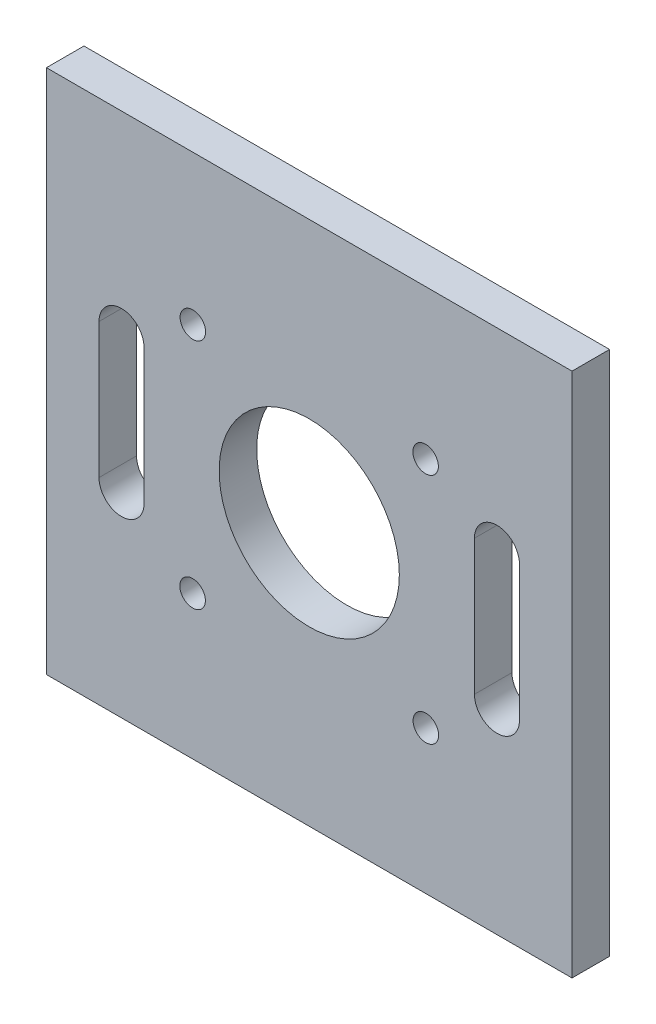
ISO-10303-21;
HEADER;
FILE_DESCRIPTION(('STEP AP214'),'2;1');
FILE_NAME('part.step','',(''),(''),'','','');
FILE_SCHEMA(('AUTOMOTIVE_DESIGN { 1 0 10303 214 1 1 1 1 }'));
ENDSEC;
DATA;
#1=APPLICATION_CONTEXT('core data for automotive mechanical design processes');
#2=APPLICATION_PROTOCOL_DEFINITION('international standard','automotive_design',2000,#1);
#3=PRODUCT_CONTEXT('',#1,'mechanical');
#4=PRODUCT('Part','Part','',(#3));
#5=PRODUCT_RELATED_PRODUCT_CATEGORY('part','',(#4));
#6=PRODUCT_DEFINITION_FORMATION('','',#4);
#7=PRODUCT_DEFINITION_CONTEXT('part definition',#1,'design');
#8=PRODUCT_DEFINITION('design','',#6,#7);
#9=PRODUCT_DEFINITION_SHAPE('','',#8);
#10=(LENGTH_UNIT() NAMED_UNIT(*) SI_UNIT(.MILLI.,.METRE.));
#11=(NAMED_UNIT(*) PLANE_ANGLE_UNIT() SI_UNIT($,.RADIAN.));
#12=(NAMED_UNIT(*) SI_UNIT($,.STERADIAN.) SOLID_ANGLE_UNIT());
#13=UNCERTAINTY_MEASURE_WITH_UNIT(LENGTH_MEASURE(1.E-05),#10,'distance_accuracy_value','');
#14=(GEOMETRIC_REPRESENTATION_CONTEXT(3) GLOBAL_UNCERTAINTY_ASSIGNED_CONTEXT((#13)) GLOBAL_UNIT_ASSIGNED_CONTEXT((#10,
#11,#12)) REPRESENTATION_CONTEXT('',''));
#15=CARTESIAN_POINT('',(0.,0.,0.));
#16=DIRECTION('',(0.,0.,1.));
#17=DIRECTION('',(1.,0.,0.));
#18=AXIS2_PLACEMENT_3D('',#15,#16,#17);
#19=CARTESIAN_POINT('',(0.,0.,5.));
#20=DIRECTION('',(0.,0.,-1.));
#21=DIRECTION('',(-1.,0.,0.));
#22=AXIS2_PLACEMENT_3D('',#19,#20,#21);
#23=PLANE('',#22);
#24=DIRECTION('',(0.,-1.,0.));
#25=VECTOR('',#24,1.);
#26=CARTESIAN_POINT('',(-27.9999999999999,9.2232248104714,5.));
#27=LINE('',#26,#25);
#28=CARTESIAN_POINT('',(-27.9999999999999,9.2232248104714,5.));
#29=VERTEX_POINT('',#28);
#30=CARTESIAN_POINT('',(-27.9999999999999,-8.77677518952859,5.));
#31=VERTEX_POINT('',#30);
#32=EDGE_CURVE('E175',#29,#31,#27,.T.);
#33=ORIENTED_EDGE('',*,*,#32,.F.);
#34=CARTESIAN_POINT('',(-24.9999999999999,9.2232248104714,5.));
#35=DIRECTION('',(0.,0.,1.));
#36=DIRECTION('',(1.,0.,0.));
#37=AXIS2_PLACEMENT_3D('',#34,#35,#36);
#38=CIRCLE('',#37,3.);
#39=CARTESIAN_POINT('',(-21.9999999999999,9.2232248104714,5.));
#40=VERTEX_POINT('',#39);
#41=EDGE_CURVE('E61',#40,#29,#38,.T.);
#42=ORIENTED_EDGE('',*,*,#41,.F.);
#43=DIRECTION('',(0.,-1.,0.));
#44=VECTOR('',#43,1.);
#45=CARTESIAN_POINT('',(-21.9999999999999,9.2232248104714,5.));
#46=LINE('',#45,#44);
#47=CARTESIAN_POINT('',(-21.9999999999999,-8.77677518952859,5.));
#48=VERTEX_POINT('',#47);
#49=EDGE_CURVE('E157',#40,#48,#46,.T.);
#50=ORIENTED_EDGE('',*,*,#49,.T.);
#51=CARTESIAN_POINT('',(-24.9999999999999,-8.77677518952859,5.));
#52=DIRECTION('',(0.,0.,1.));
#53=DIRECTION('',(1.,0.,0.));
#54=AXIS2_PLACEMENT_3D('',#51,#52,#53);
#55=CIRCLE('',#54,3.);
#56=EDGE_CURVE('E162',#31,#48,#55,.T.);
#57=ORIENTED_EDGE('',*,*,#56,.F.);
#58=EDGE_LOOP('',(#33,#42,#50,#57));
#59=FACE_BOUND('',#58,.T.);
#60=CARTESIAN_POINT('',(-15.5,15.112797807295,5.));
#61=DIRECTION('',(0.,0.,-1.));
#62=DIRECTION('',(-1.,0.,0.));
#63=AXIS2_PLACEMENT_3D('',#60,#61,#62);
#64=CIRCLE('',#63,1.7);
#65=CARTESIAN_POINT('',(-17.2,15.112797807295,5.));
#66=VERTEX_POINT('',#65);
#67=EDGE_CURVE('E252',#66,#66,#64,.T.);
#68=ORIENTED_EDGE('',*,*,#67,.T.);
#69=EDGE_LOOP('',(#68));
#70=FACE_BOUND('',#69,.T.);
#71=CARTESIAN_POINT('',(-15.5322926347606,-15.8871853731156,5.));
#72=DIRECTION('',(0.,0.,-1.));
#73=DIRECTION('',(-1.,0.,0.));
#74=AXIS2_PLACEMENT_3D('',#71,#72,#73);
#75=CIRCLE('',#74,1.7);
#76=CARTESIAN_POINT('',(-17.2322926347606,-15.8871853731156,5.));
#77=VERTEX_POINT('',#76);
#78=EDGE_CURVE('E243',#77,#77,#75,.T.);
#79=ORIENTED_EDGE('',*,*,#78,.T.);
#80=EDGE_LOOP('',(#79));
#81=FACE_BOUND('',#80,.T.);
#82=DIRECTION('',(0.,-1.,0.));
#83=VECTOR('',#82,1.);
#84=CARTESIAN_POINT('',(-35.,35.,5.));
#85=LINE('',#84,#83);
#86=CARTESIAN_POINT('',(-35.,35.,5.));
#87=VERTEX_POINT('',#86);
#88=CARTESIAN_POINT('',(-35.,-35.,5.));
#89=VERTEX_POINT('',#88);
#90=EDGE_CURVE('E270',#87,#89,#85,.T.);
#91=ORIENTED_EDGE('',*,*,#90,.T.);
#92=DIRECTION('',(1.,0.,0.));
#93=VECTOR('',#92,1.);
#94=CARTESIAN_POINT('',(35.,-35.,5.));
#95=LINE('',#94,#93);
#96=CARTESIAN_POINT('',(35.,-35.,5.));
#97=VERTEX_POINT('',#96);
#98=EDGE_CURVE('E271',#89,#97,#95,.T.);
#99=ORIENTED_EDGE('',*,*,#98,.T.);
#100=DIRECTION('',(0.,1.,0.));
#101=VECTOR('',#100,1.);
#102=CARTESIAN_POINT('',(35.,35.,5.));
#103=LINE('',#102,#101);
#104=CARTESIAN_POINT('',(35.,35.,5.));
#105=VERTEX_POINT('',#104);
#106=EDGE_CURVE('E274',#97,#105,#103,.T.);
#107=ORIENTED_EDGE('',*,*,#106,.T.);
#108=DIRECTION('',(-1.,0.,0.));
#109=VECTOR('',#108,1.);
#110=CARTESIAN_POINT('',(35.,35.,5.));
#111=LINE('',#110,#109);
#112=EDGE_CURVE('E279',#105,#87,#111,.T.);
#113=ORIENTED_EDGE('',*,*,#112,.T.);
#114=EDGE_LOOP('',(#91,#99,#107,#113));
#115=FACE_BOUND('',#114,.T.);
#116=CARTESIAN_POINT('',(15.5,15.112797807295,5.));
#117=DIRECTION('',(0.,0.,1.));
#118=DIRECTION('',(1.,0.,0.));
#119=AXIS2_PLACEMENT_3D('',#116,#117,#118);
#120=CIRCLE('',#119,1.7);
#121=CARTESIAN_POINT('',(17.2,15.112797807295,5.));
#122=VERTEX_POINT('',#121);
#123=EDGE_CURVE('E232',#122,#122,#120,.T.);
#124=ORIENTED_EDGE('',*,*,#123,.F.);
#125=EDGE_LOOP('',(#124));
#126=FACE_BOUND('',#125,.T.);
#127=CARTESIAN_POINT('',(15.5322926347607,-15.8871853731156,5.));
#128=DIRECTION('',(0.,0.,1.));
#129=DIRECTION('',(1.,0.,0.));
#130=AXIS2_PLACEMENT_3D('',#127,#128,#129);
#131=CIRCLE('',#130,1.7);
#132=CARTESIAN_POINT('',(17.2322926347607,-15.8871853731156,5.));
#133=VERTEX_POINT('',#132);
#134=EDGE_CURVE('E230',#133,#133,#131,.T.);
#135=ORIENTED_EDGE('',*,*,#134,.F.);
#136=EDGE_LOOP('',(#135));
#137=FACE_BOUND('',#136,.T.);
#138=CARTESIAN_POINT('',(0.,0.,5.));
#139=DIRECTION('',(0.,0.,1.));
#140=DIRECTION('',(1.,0.,0.));
#141=AXIS2_PLACEMENT_3D('',#138,#139,#140);
#142=CIRCLE('',#141,12.);
#143=CARTESIAN_POINT('',(12.,0.,5.));
#144=VERTEX_POINT('',#143);
#145=EDGE_CURVE('E237',#144,#144,#142,.T.);
#146=ORIENTED_EDGE('',*,*,#145,.F.);
#147=EDGE_LOOP('',(#146));
#148=FACE_BOUND('',#147,.T.);
#149=CARTESIAN_POINT('',(24.9999999999999,9.2232248104714,5.));
#150=DIRECTION('',(0.,0.,-1.));
#151=DIRECTION('',(-1.,0.,0.));
#152=AXIS2_PLACEMENT_3D('',#149,#150,#151);
#153=CIRCLE('',#152,3.);
#154=CARTESIAN_POINT('',(21.9999999999999,9.2232248104714,5.));
#155=VERTEX_POINT('',#154);
#156=CARTESIAN_POINT('',(27.9999999999999,9.2232248104714,5.));
#157=VERTEX_POINT('',#156);
#158=EDGE_CURVE('E69',#155,#157,#153,.T.);
#159=ORIENTED_EDGE('',*,*,#158,.T.);
#160=DIRECTION('',(0.,-1.,0.));
#161=VECTOR('',#160,1.);
#162=CARTESIAN_POINT('',(27.9999999999999,9.2232248104714,5.));
#163=LINE('',#162,#161);
#164=CARTESIAN_POINT('',(27.9999999999999,-8.7767751895286,5.));
#165=VERTEX_POINT('',#164);
#166=EDGE_CURVE('E207',#157,#165,#163,.T.);
#167=ORIENTED_EDGE('',*,*,#166,.T.);
#168=CARTESIAN_POINT('',(24.9999999999999,-8.7767751895286,5.));
#169=DIRECTION('',(0.,0.,-1.));
#170=DIRECTION('',(-1.,0.,0.));
#171=AXIS2_PLACEMENT_3D('',#168,#169,#170);
#172=CIRCLE('',#171,3.);
#173=CARTESIAN_POINT('',(21.9999999999999,-8.7767751895286,5.));
#174=VERTEX_POINT('',#173);
#175=EDGE_CURVE('E204',#165,#174,#172,.T.);
#176=ORIENTED_EDGE('',*,*,#175,.T.);
#177=DIRECTION('',(0.,-1.,0.));
#178=VECTOR('',#177,1.);
#179=CARTESIAN_POINT('',(21.9999999999999,9.2232248104714,5.));
#180=LINE('',#179,#178);
#181=EDGE_CURVE('E199',#155,#174,#180,.T.);
#182=ORIENTED_EDGE('',*,*,#181,.F.);
#183=EDGE_LOOP('',(#159,#167,#176,#182));
#184=FACE_BOUND('',#183,.T.);
#185=ADVANCED_FACE('F44',(#59,#70,#81,#115,#126,#137,#148,#184),#23,.F.);
#186=CARTESIAN_POINT('',(0.,0.,0.));
#187=DIRECTION('',(0.,0.,-1.));
#188=DIRECTION('',(-1.,0.,0.));
#189=AXIS2_PLACEMENT_3D('',#186,#187,#188);
#190=PLANE('',#189);
#191=CARTESIAN_POINT('',(-24.9999999999999,9.2232248104714,0.));
#192=DIRECTION('',(0.,0.,1.));
#193=DIRECTION('',(1.,0.,0.));
#194=AXIS2_PLACEMENT_3D('',#191,#192,#193);
#195=CIRCLE('',#194,3.);
#196=CARTESIAN_POINT('',(-21.9999999999999,9.2232248104714,0.));
#197=VERTEX_POINT('',#196);
#198=CARTESIAN_POINT('',(-27.9999999999999,9.2232248104714,0.));
#199=VERTEX_POINT('',#198);
#200=EDGE_CURVE('E138',#197,#199,#195,.T.);
#201=ORIENTED_EDGE('',*,*,#200,.T.);
#202=DIRECTION('',(0.,-1.,0.));
#203=VECTOR('',#202,1.);
#204=CARTESIAN_POINT('',(-27.9999999999999,9.2232248104714,0.));
#205=LINE('',#204,#203);
#206=CARTESIAN_POINT('',(-27.9999999999999,-8.77677518952859,0.));
#207=VERTEX_POINT('',#206);
#208=EDGE_CURVE('E149',#199,#207,#205,.T.);
#209=ORIENTED_EDGE('',*,*,#208,.T.);
#210=CARTESIAN_POINT('',(-24.9999999999999,-8.77677518952859,0.));
#211=DIRECTION('',(0.,0.,1.));
#212=DIRECTION('',(1.,0.,0.));
#213=AXIS2_PLACEMENT_3D('',#210,#211,#212);
#214=CIRCLE('',#213,3.);
#215=CARTESIAN_POINT('',(-21.9999999999999,-8.77677518952859,0.));
#216=VERTEX_POINT('',#215);
#217=EDGE_CURVE('E152',#207,#216,#214,.T.);
#218=ORIENTED_EDGE('',*,*,#217,.T.);
#219=DIRECTION('',(0.,-1.,0.));
#220=VECTOR('',#219,1.);
#221=CARTESIAN_POINT('',(-21.9999999999999,9.2232248104714,0.));
#222=LINE('',#221,#220);
#223=EDGE_CURVE('E144',#197,#216,#222,.T.);
#224=ORIENTED_EDGE('',*,*,#223,.F.);
#225=EDGE_LOOP('',(#201,#209,#218,#224));
#226=FACE_BOUND('',#225,.T.);
#227=CARTESIAN_POINT('',(-15.5322926347606,-15.8871853731156,0.));
#228=DIRECTION('',(0.,0.,-1.));
#229=DIRECTION('',(-1.,0.,0.));
#230=AXIS2_PLACEMENT_3D('',#227,#228,#229);
#231=CIRCLE('',#230,1.7);
#232=CARTESIAN_POINT('',(-17.2322926347606,-15.8871853731156,0.));
#233=VERTEX_POINT('',#232);
#234=EDGE_CURVE('E248',#233,#233,#231,.T.);
#235=ORIENTED_EDGE('',*,*,#234,.F.);
#236=EDGE_LOOP('',(#235));
#237=FACE_BOUND('',#236,.T.);
#238=CARTESIAN_POINT('',(0.,0.,0.));
#239=DIRECTION('',(0.,0.,1.));
#240=DIRECTION('',(1.,0.,0.));
#241=AXIS2_PLACEMENT_3D('',#238,#239,#240);
#242=CIRCLE('',#241,12.);
#243=CARTESIAN_POINT('',(12.,0.,0.));
#244=VERTEX_POINT('',#243);
#245=EDGE_CURVE('E238',#244,#244,#242,.T.);
#246=ORIENTED_EDGE('',*,*,#245,.T.);
#247=EDGE_LOOP('',(#246));
#248=FACE_BOUND('',#247,.T.);
#249=CARTESIAN_POINT('',(15.5322926347607,-15.8871853731156,0.));
#250=DIRECTION('',(0.,0.,1.));
#251=DIRECTION('',(1.,0.,0.));
#252=AXIS2_PLACEMENT_3D('',#249,#250,#251);
#253=CIRCLE('',#252,1.7);
#254=CARTESIAN_POINT('',(17.2322926347607,-15.8871853731156,0.));
#255=VERTEX_POINT('',#254);
#256=EDGE_CURVE('E235',#255,#255,#253,.T.);
#257=ORIENTED_EDGE('',*,*,#256,.T.);
#258=EDGE_LOOP('',(#257));
#259=FACE_BOUND('',#258,.T.);
#260=CARTESIAN_POINT('',(15.5,15.112797807295,0.));
#261=DIRECTION('',(0.,0.,1.));
#262=DIRECTION('',(1.,0.,0.));
#263=AXIS2_PLACEMENT_3D('',#260,#261,#262);
#264=CIRCLE('',#263,1.7);
#265=CARTESIAN_POINT('',(17.2,15.112797807295,0.));
#266=VERTEX_POINT('',#265);
#267=EDGE_CURVE('E259',#266,#266,#264,.T.);
#268=ORIENTED_EDGE('',*,*,#267,.T.);
#269=EDGE_LOOP('',(#268));
#270=FACE_BOUND('',#269,.T.);
#271=DIRECTION('',(0.,-1.,0.));
#272=VECTOR('',#271,1.);
#273=CARTESIAN_POINT('',(-35.,35.,0.));
#274=LINE('',#273,#272);
#275=CARTESIAN_POINT('',(-35.,35.,0.));
#276=VERTEX_POINT('',#275);
#277=CARTESIAN_POINT('',(-35.,-35.,0.));
#278=VERTEX_POINT('',#277);
#279=EDGE_CURVE('E263',#276,#278,#274,.T.);
#280=ORIENTED_EDGE('',*,*,#279,.F.);
#281=DIRECTION('',(-1.,0.,0.));
#282=VECTOR('',#281,1.);
#283=CARTESIAN_POINT('',(35.,35.,0.));
#284=LINE('',#283,#282);
#285=CARTESIAN_POINT('',(35.,35.,0.));
#286=VERTEX_POINT('',#285);
#287=EDGE_CURVE('E275',#286,#276,#284,.T.);
#288=ORIENTED_EDGE('',*,*,#287,.F.);
#289=DIRECTION('',(0.,1.,0.));
#290=VECTOR('',#289,1.);
#291=CARTESIAN_POINT('',(35.,35.,0.));
#292=LINE('',#291,#290);
#293=CARTESIAN_POINT('',(35.,-35.,0.));
#294=VERTEX_POINT('',#293);
#295=EDGE_CURVE('E288',#294,#286,#292,.T.);
#296=ORIENTED_EDGE('',*,*,#295,.F.);
#297=DIRECTION('',(1.,0.,0.));
#298=VECTOR('',#297,1.);
#299=CARTESIAN_POINT('',(35.,-35.,0.));
#300=LINE('',#299,#298);
#301=EDGE_CURVE('E284',#278,#294,#300,.T.);
#302=ORIENTED_EDGE('',*,*,#301,.F.);
#303=EDGE_LOOP('',(#280,#288,#296,#302));
#304=FACE_BOUND('',#303,.T.);
#305=CARTESIAN_POINT('',(-15.5,15.112797807295,0.));
#306=DIRECTION('',(0.,0.,-1.));
#307=DIRECTION('',(-1.,0.,0.));
#308=AXIS2_PLACEMENT_3D('',#305,#306,#307);
#309=CIRCLE('',#308,1.7);
#310=CARTESIAN_POINT('',(-17.2,15.112797807295,0.));
#311=VERTEX_POINT('',#310);
#312=EDGE_CURVE('E182',#311,#311,#309,.T.);
#313=ORIENTED_EDGE('',*,*,#312,.F.);
#314=EDGE_LOOP('',(#313));
#315=FACE_BOUND('',#314,.T.);
#316=DIRECTION('',(0.,-1.,0.));
#317=VECTOR('',#316,1.);
#318=CARTESIAN_POINT('',(27.9999999999999,9.2232248104714,0.));
#319=LINE('',#318,#317);
#320=CARTESIAN_POINT('',(27.9999999999999,9.2232248104714,0.));
#321=VERTEX_POINT('',#320);
#322=CARTESIAN_POINT('',(27.9999999999999,-8.7767751895286,0.));
#323=VERTEX_POINT('',#322);
#324=EDGE_CURVE('E225',#321,#323,#319,.T.);
#325=ORIENTED_EDGE('',*,*,#324,.F.);
#326=CARTESIAN_POINT('',(24.9999999999999,9.2232248104714,0.));
#327=DIRECTION('',(0.,0.,-1.));
#328=DIRECTION('',(-1.,0.,0.));
#329=AXIS2_PLACEMENT_3D('',#326,#327,#328);
#330=CIRCLE('',#329,3.);
#331=CARTESIAN_POINT('',(21.9999999999999,9.2232248104714,0.));
#332=VERTEX_POINT('',#331);
#333=EDGE_CURVE('E202',#332,#321,#330,.T.);
#334=ORIENTED_EDGE('',*,*,#333,.F.);
#335=DIRECTION('',(0.,-1.,0.));
#336=VECTOR('',#335,1.);
#337=CARTESIAN_POINT('',(21.9999999999999,9.2232248104714,0.));
#338=LINE('',#337,#336);
#339=CARTESIAN_POINT('',(21.9999999999999,-8.7767751895286,0.));
#340=VERTEX_POINT('',#339);
#341=EDGE_CURVE('E200',#332,#340,#338,.T.);
#342=ORIENTED_EDGE('',*,*,#341,.T.);
#343=CARTESIAN_POINT('',(24.9999999999999,-8.7767751895286,0.));
#344=DIRECTION('',(0.,0.,-1.));
#345=DIRECTION('',(-1.,0.,0.));
#346=AXIS2_PLACEMENT_3D('',#343,#344,#345);
#347=CIRCLE('',#346,3.);
#348=EDGE_CURVE('E217',#323,#340,#347,.T.);
#349=ORIENTED_EDGE('',*,*,#348,.F.);
#350=EDGE_LOOP('',(#325,#334,#342,#349));
#351=FACE_BOUND('',#350,.T.);
#352=ADVANCED_FACE('F156',(#226,#237,#248,#259,#270,#304,#315,#351),#190,.T.);
#353=CARTESIAN_POINT('',(-35.,35.,5.));
#354=DIRECTION('',(1.,0.,0.));
#355=DIRECTION('',(0.,0.,-1.));
#356=AXIS2_PLACEMENT_3D('',#353,#354,#355);
#357=PLANE('',#356);
#358=ORIENTED_EDGE('',*,*,#279,.T.);
#359=DIRECTION('',(0.,0.,-1.));
#360=VECTOR('',#359,1.);
#361=CARTESIAN_POINT('',(-35.,-35.,5.));
#362=LINE('',#361,#360);
#363=EDGE_CURVE('E11',#89,#278,#362,.T.);
#364=ORIENTED_EDGE('',*,*,#363,.F.);
#365=ORIENTED_EDGE('',*,*,#90,.F.);
#366=DIRECTION('',(0.,0.,-1.));
#367=VECTOR('',#366,1.);
#368=CARTESIAN_POINT('',(-35.,35.,5.));
#369=LINE('',#368,#367);
#370=EDGE_CURVE('E281',#87,#276,#369,.T.);
#371=ORIENTED_EDGE('',*,*,#370,.T.);
#372=EDGE_LOOP('',(#358,#364,#365,#371));
#373=FACE_BOUND('',#372,.T.);
#374=ADVANCED_FACE('F50',(#373),#357,.F.);
#375=CARTESIAN_POINT('',(35.,-35.,5.));
#376=DIRECTION('',(0.,1.,0.));
#377=DIRECTION('',(-1.,0.,0.));
#378=AXIS2_PLACEMENT_3D('',#375,#376,#377);
#379=PLANE('',#378);
#380=ORIENTED_EDGE('',*,*,#301,.T.);
#381=DIRECTION('',(0.,0.,-1.));
#382=VECTOR('',#381,1.);
#383=CARTESIAN_POINT('',(35.,-35.,5.));
#384=LINE('',#383,#382);
#385=EDGE_CURVE('E53',#97,#294,#384,.T.);
#386=ORIENTED_EDGE('',*,*,#385,.F.);
#387=ORIENTED_EDGE('',*,*,#98,.F.);
#388=ORIENTED_EDGE('',*,*,#363,.T.);
#389=EDGE_LOOP('',(#380,#386,#387,#388));
#390=FACE_BOUND('',#389,.T.);
#391=ADVANCED_FACE('F321',(#390),#379,.F.);
#392=CARTESIAN_POINT('',(35.,35.,5.));
#393=DIRECTION('',(-1.,0.,0.));
#394=DIRECTION('',(0.,0.,1.));
#395=AXIS2_PLACEMENT_3D('',#392,#393,#394);
#396=PLANE('',#395);
#397=ORIENTED_EDGE('',*,*,#295,.T.);
#398=DIRECTION('',(0.,0.,-1.));
#399=VECTOR('',#398,1.);
#400=CARTESIAN_POINT('',(35.,35.,5.));
#401=LINE('',#400,#399);
#402=EDGE_CURVE('E296',#105,#286,#401,.T.);
#403=ORIENTED_EDGE('',*,*,#402,.F.);
#404=ORIENTED_EDGE('',*,*,#106,.F.);
#405=ORIENTED_EDGE('',*,*,#385,.T.);
#406=EDGE_LOOP('',(#397,#403,#404,#405));
#407=FACE_BOUND('',#406,.T.);
#408=ADVANCED_FACE('F301',(#407),#396,.F.);
#409=CARTESIAN_POINT('',(35.,35.,5.));
#410=DIRECTION('',(0.,-1.,0.));
#411=DIRECTION('',(1.,0.,0.));
#412=AXIS2_PLACEMENT_3D('',#409,#410,#411);
#413=PLANE('',#412);
#414=ORIENTED_EDGE('',*,*,#287,.T.);
#415=ORIENTED_EDGE('',*,*,#370,.F.);
#416=ORIENTED_EDGE('',*,*,#112,.F.);
#417=ORIENTED_EDGE('',*,*,#402,.T.);
#418=EDGE_LOOP('',(#414,#415,#416,#417));
#419=FACE_BOUND('',#418,.T.);
#420=ADVANCED_FACE('F314',(#419),#413,.F.);
#421=CARTESIAN_POINT('',(15.5,15.112797807295,0.));
#422=DIRECTION('',(0.,0.,1.));
#423=DIRECTION('',(1.,0.,0.));
#424=AXIS2_PLACEMENT_3D('',#421,#422,#423);
#425=CYLINDRICAL_SURFACE('',#424,1.7);
#426=ORIENTED_EDGE('',*,*,#267,.F.);
#427=EDGE_LOOP('',(#426));
#428=FACE_BOUND('',#427,.T.);
#429=ORIENTED_EDGE('',*,*,#123,.T.);
#430=EDGE_LOOP('',(#429));
#431=FACE_BOUND('',#430,.T.);
#432=ADVANCED_FACE('F337',(#428,#431),#425,.F.);
#433=CARTESIAN_POINT('',(15.5322926347607,-15.8871853731156,0.));
#434=DIRECTION('',(0.,0.,1.));
#435=DIRECTION('',(1.,0.,0.));
#436=AXIS2_PLACEMENT_3D('',#433,#434,#435);
#437=CYLINDRICAL_SURFACE('',#436,1.7);
#438=ORIENTED_EDGE('',*,*,#256,.F.);
#439=EDGE_LOOP('',(#438));
#440=FACE_BOUND('',#439,.T.);
#441=ORIENTED_EDGE('',*,*,#134,.T.);
#442=EDGE_LOOP('',(#441));
#443=FACE_BOUND('',#442,.T.);
#444=ADVANCED_FACE('F341',(#440,#443),#437,.F.);
#445=CARTESIAN_POINT('',(0.,0.,0.));
#446=DIRECTION('',(0.,0.,1.));
#447=DIRECTION('',(1.,0.,0.));
#448=AXIS2_PLACEMENT_3D('',#445,#446,#447);
#449=CYLINDRICAL_SURFACE('',#448,12.);
#450=ORIENTED_EDGE('',*,*,#245,.F.);
#451=EDGE_LOOP('',(#450));
#452=FACE_BOUND('',#451,.T.);
#453=ORIENTED_EDGE('',*,*,#145,.T.);
#454=EDGE_LOOP('',(#453));
#455=FACE_BOUND('',#454,.T.);
#456=ADVANCED_FACE('F348',(#452,#455),#449,.F.);
#457=CARTESIAN_POINT('',(-15.5322926347606,-15.8871853731156,0.));
#458=DIRECTION('',(0.,0.,1.));
#459=DIRECTION('',(1.,0.,0.));
#460=AXIS2_PLACEMENT_3D('',#457,#458,#459);
#461=CYLINDRICAL_SURFACE('',#460,1.7);
#462=ORIENTED_EDGE('',*,*,#234,.T.);
#463=EDGE_LOOP('',(#462));
#464=FACE_BOUND('',#463,.T.);
#465=ORIENTED_EDGE('',*,*,#78,.F.);
#466=EDGE_LOOP('',(#465));
#467=FACE_BOUND('',#466,.T.);
#468=ADVANCED_FACE('F386',(#464,#467),#461,.F.);
#469=CARTESIAN_POINT('',(-15.5,15.112797807295,0.));
#470=DIRECTION('',(0.,0.,1.));
#471=DIRECTION('',(1.,0.,0.));
#472=AXIS2_PLACEMENT_3D('',#469,#470,#471);
#473=CYLINDRICAL_SURFACE('',#472,1.7);
#474=ORIENTED_EDGE('',*,*,#312,.T.);
#475=EDGE_LOOP('',(#474));
#476=FACE_BOUND('',#475,.T.);
#477=ORIENTED_EDGE('',*,*,#67,.F.);
#478=EDGE_LOOP('',(#477));
#479=FACE_BOUND('',#478,.T.);
#480=ADVANCED_FACE('F395',(#476,#479),#473,.F.);
#481=CARTESIAN_POINT('',(24.9999999999999,9.2232248104714,0.));
#482=DIRECTION('',(0.,0.,1.));
#483=DIRECTION('',(1.,0.,0.));
#484=AXIS2_PLACEMENT_3D('',#481,#482,#483);
#485=CYLINDRICAL_SURFACE('',#484,3.);
#486=ORIENTED_EDGE('',*,*,#158,.F.);
#487=DIRECTION('',(0.,0.,1.));
#488=VECTOR('',#487,1.);
#489=CARTESIAN_POINT('',(21.9999999999999,9.2232248104714,0.));
#490=LINE('',#489,#488);
#491=EDGE_CURVE('E198',#332,#155,#490,.T.);
#492=ORIENTED_EDGE('',*,*,#491,.F.);
#493=ORIENTED_EDGE('',*,*,#333,.T.);
#494=DIRECTION('',(0.,0.,1.));
#495=VECTOR('',#494,1.);
#496=CARTESIAN_POINT('',(27.9999999999999,9.2232248104714,0.));
#497=LINE('',#496,#495);
#498=EDGE_CURVE('E190',#321,#157,#497,.T.);
#499=ORIENTED_EDGE('',*,*,#498,.T.);
#500=EDGE_LOOP('',(#486,#492,#493,#499));
#501=FACE_BOUND('',#500,.T.);
#502=ADVANCED_FACE('F370',(#501),#485,.F.);
#503=CARTESIAN_POINT('',(27.9999999999999,9.2232248104714,0.));
#504=DIRECTION('',(-1.,0.,0.));
#505=DIRECTION('',(0.,-1.,0.));
#506=AXIS2_PLACEMENT_3D('',#503,#504,#505);
#507=PLANE('',#506);
#508=ORIENTED_EDGE('',*,*,#166,.F.);
#509=ORIENTED_EDGE('',*,*,#498,.F.);
#510=ORIENTED_EDGE('',*,*,#324,.T.);
#511=DIRECTION('',(0.,0.,1.));
#512=VECTOR('',#511,1.);
#513=CARTESIAN_POINT('',(27.9999999999999,-8.7767751895286,0.));
#514=LINE('',#513,#512);
#515=EDGE_CURVE('E189',#323,#165,#514,.T.);
#516=ORIENTED_EDGE('',*,*,#515,.T.);
#517=EDGE_LOOP('',(#508,#509,#510,#516));
#518=FACE_BOUND('',#517,.T.);
#519=ADVANCED_FACE('F375',(#518),#507,.T.);
#520=CARTESIAN_POINT('',(24.9999999999999,-8.7767751895286,0.));
#521=DIRECTION('',(0.,0.,1.));
#522=DIRECTION('',(1.,0.,0.));
#523=AXIS2_PLACEMENT_3D('',#520,#521,#522);
#524=CYLINDRICAL_SURFACE('',#523,3.);
#525=ORIENTED_EDGE('',*,*,#175,.F.);
#526=ORIENTED_EDGE('',*,*,#515,.F.);
#527=ORIENTED_EDGE('',*,*,#348,.T.);
#528=DIRECTION('',(0.,0.,1.));
#529=VECTOR('',#528,1.);
#530=CARTESIAN_POINT('',(21.9999999999999,-8.7767751895286,0.));
#531=LINE('',#530,#529);
#532=EDGE_CURVE('E193',#340,#174,#531,.T.);
#533=ORIENTED_EDGE('',*,*,#532,.T.);
#534=EDGE_LOOP('',(#525,#526,#527,#533));
#535=FACE_BOUND('',#534,.T.);
#536=ADVANCED_FACE('F376',(#535),#524,.F.);
#537=CARTESIAN_POINT('',(21.9999999999999,9.2232248104714,0.));
#538=DIRECTION('',(-1.,0.,0.));
#539=DIRECTION('',(0.,-1.,0.));
#540=AXIS2_PLACEMENT_3D('',#537,#538,#539);
#541=PLANE('',#540);
#542=ORIENTED_EDGE('',*,*,#181,.T.);
#543=ORIENTED_EDGE('',*,*,#532,.F.);
#544=ORIENTED_EDGE('',*,*,#341,.F.);
#545=ORIENTED_EDGE('',*,*,#491,.T.);
#546=EDGE_LOOP('',(#542,#543,#544,#545));
#547=FACE_BOUND('',#546,.T.);
#548=ADVANCED_FACE('F365',(#547),#541,.F.);
#549=CARTESIAN_POINT('',(-24.9999999999999,9.2232248104714,0.));
#550=DIRECTION('',(0.,0.,1.));
#551=DIRECTION('',(1.,0.,0.));
#552=AXIS2_PLACEMENT_3D('',#549,#550,#551);
#553=CYLINDRICAL_SURFACE('',#552,3.);
#554=ORIENTED_EDGE('',*,*,#41,.T.);
#555=DIRECTION('',(0.,0.,1.));
#556=VECTOR('',#555,1.);
#557=CARTESIAN_POINT('',(-27.9999999999999,9.2232248104714,0.));
#558=LINE('',#557,#556);
#559=EDGE_CURVE('E133',#199,#29,#558,.T.);
#560=ORIENTED_EDGE('',*,*,#559,.F.);
#561=ORIENTED_EDGE('',*,*,#200,.F.);
#562=DIRECTION('',(0.,0.,1.));
#563=VECTOR('',#562,1.);
#564=CARTESIAN_POINT('',(-21.9999999999999,9.2232248104714,0.));
#565=LINE('',#564,#563);
#566=EDGE_CURVE('E178',#197,#40,#565,.T.);
#567=ORIENTED_EDGE('',*,*,#566,.T.);
#568=EDGE_LOOP('',(#554,#560,#561,#567));
#569=FACE_BOUND('',#568,.T.);
#570=ADVANCED_FACE('F137',(#569),#553,.F.);
#571=CARTESIAN_POINT('',(-21.9999999999999,9.2232248104714,0.));
#572=DIRECTION('',(-1.,0.,0.));
#573=DIRECTION('',(0.,0.,1.));
#574=AXIS2_PLACEMENT_3D('',#571,#572,#573);
#575=PLANE('',#574);
#576=ORIENTED_EDGE('',*,*,#49,.F.);
#577=ORIENTED_EDGE('',*,*,#566,.F.);
#578=ORIENTED_EDGE('',*,*,#223,.T.);
#579=DIRECTION('',(0.,0.,1.));
#580=VECTOR('',#579,1.);
#581=CARTESIAN_POINT('',(-21.9999999999999,-8.77677518952859,0.));
#582=LINE('',#581,#580);
#583=EDGE_CURVE('E185',#216,#48,#582,.T.);
#584=ORIENTED_EDGE('',*,*,#583,.T.);
#585=EDGE_LOOP('',(#576,#577,#578,#584));
#586=FACE_BOUND('',#585,.T.);
#587=ADVANCED_FACE('F408',(#586),#575,.T.);
#588=CARTESIAN_POINT('',(-24.9999999999999,-8.77677518952859,0.));
#589=DIRECTION('',(0.,0.,1.));
#590=DIRECTION('',(1.,0.,0.));
#591=AXIS2_PLACEMENT_3D('',#588,#589,#590);
#592=CYLINDRICAL_SURFACE('',#591,3.);
#593=ORIENTED_EDGE('',*,*,#56,.T.);
#594=ORIENTED_EDGE('',*,*,#583,.F.);
#595=ORIENTED_EDGE('',*,*,#217,.F.);
#596=DIRECTION('',(0.,0.,1.));
#597=VECTOR('',#596,1.);
#598=CARTESIAN_POINT('',(-27.9999999999999,-8.77677518952859,0.));
#599=LINE('',#598,#597);
#600=EDGE_CURVE('E145',#207,#31,#599,.T.);
#601=ORIENTED_EDGE('',*,*,#600,.T.);
#602=EDGE_LOOP('',(#593,#594,#595,#601));
#603=FACE_BOUND('',#602,.T.);
#604=ADVANCED_FACE('F415',(#603),#592,.F.);
#605=CARTESIAN_POINT('',(-27.9999999999999,9.2232248104714,0.));
#606=DIRECTION('',(-1.,0.,0.));
#607=DIRECTION('',(0.,-1.,0.));
#608=AXIS2_PLACEMENT_3D('',#605,#606,#607);
#609=PLANE('',#608);
#610=ORIENTED_EDGE('',*,*,#32,.T.);
#611=ORIENTED_EDGE('',*,*,#600,.F.);
#612=ORIENTED_EDGE('',*,*,#208,.F.);
#613=ORIENTED_EDGE('',*,*,#559,.T.);
#614=EDGE_LOOP('',(#610,#611,#612,#613));
#615=FACE_BOUND('',#614,.T.);
#616=ADVANCED_FACE('F147',(#615),#609,.F.);
#617=CLOSED_SHELL('',(#185,#352,#374,#391,#408,#420,#432,#444,#456,#468,#480,#502,#519,#536,
#548,#570,#587,#604,#616));
#618=MANIFOLD_SOLID_BREP('B2',#617);
#619=ADVANCED_BREP_SHAPE_REPRESENTATION('',(#18,#618),#14);
#620=SHAPE_DEFINITION_REPRESENTATION(#9,#619);
ENDSEC;
END-ISO-10303-21;
